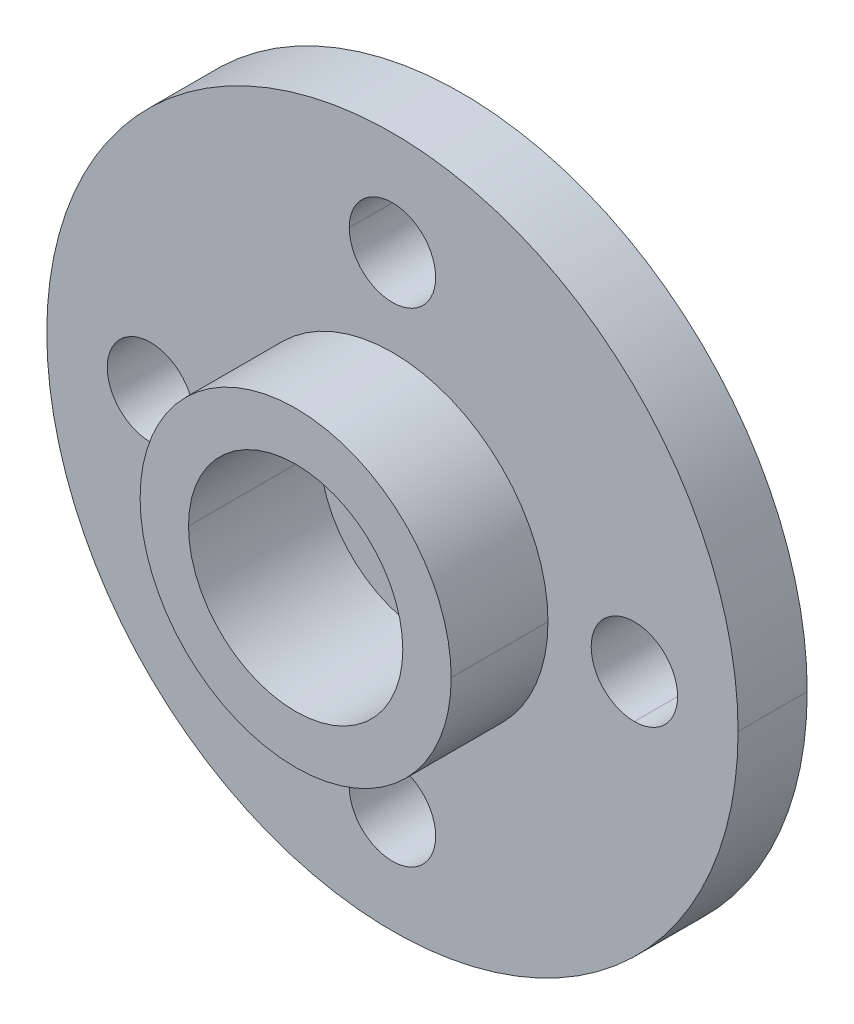
ISO-10303-21;
HEADER;
FILE_DESCRIPTION(('STEP AP214'),'2;1');
FILE_NAME('part.step','',(''),(''),'','','');
FILE_SCHEMA(('AUTOMOTIVE_DESIGN { 1 0 10303 214 1 1 1 1 }'));
ENDSEC;
DATA;
#1=APPLICATION_CONTEXT('core data for automotive mechanical design processes');
#2=APPLICATION_PROTOCOL_DEFINITION('international standard','automotive_design',2000,#1);
#3=PRODUCT_CONTEXT('',#1,'mechanical');
#4=PRODUCT('Part','Part','',(#3));
#5=PRODUCT_RELATED_PRODUCT_CATEGORY('part','',(#4));
#6=PRODUCT_DEFINITION_FORMATION('','',#4);
#7=PRODUCT_DEFINITION_CONTEXT('part definition',#1,'design');
#8=PRODUCT_DEFINITION('design','',#6,#7);
#9=PRODUCT_DEFINITION_SHAPE('','',#8);
#10=(LENGTH_UNIT() NAMED_UNIT(*) SI_UNIT(.MILLI.,.METRE.));
#11=(NAMED_UNIT(*) PLANE_ANGLE_UNIT() SI_UNIT($,.RADIAN.));
#12=(NAMED_UNIT(*) SI_UNIT($,.STERADIAN.) SOLID_ANGLE_UNIT());
#13=UNCERTAINTY_MEASURE_WITH_UNIT(LENGTH_MEASURE(1.E-05),#10,'distance_accuracy_value','');
#14=(GEOMETRIC_REPRESENTATION_CONTEXT(3) GLOBAL_UNCERTAINTY_ASSIGNED_CONTEXT((#13)) GLOBAL_UNIT_ASSIGNED_CONTEXT((#10,
#11,#12)) REPRESENTATION_CONTEXT('',''));
#15=CARTESIAN_POINT('',(0.,0.,0.));
#16=DIRECTION('',(0.,0.,1.));
#17=DIRECTION('',(1.,0.,0.));
#18=AXIS2_PLACEMENT_3D('',#15,#16,#17);
#19=CARTESIAN_POINT('',(-39.10264651977,-19.8999981269,-37.074));
#20=DIRECTION('',(0.,0.,-1.));
#21=DIRECTION('',(1.,0.,0.));
#22=AXIS2_PLACEMENT_3D('',#19,#20,#21);
#23=CYLINDRICAL_SURFACE('',#22,1.6);
#24=DIRECTION('',(0.,0.,-1.));
#25=VECTOR('',#24,1.);
#26=CARTESIAN_POINT('',(-37.50264651977,-19.8999981269,-35.124));
#27=LINE('',#26,#25);
#28=CARTESIAN_POINT('',(-37.50264651977,-19.8999981269,-35.124));
#29=VERTEX_POINT('',#28);
#30=CARTESIAN_POINT('',(-37.50264651977,-19.8999981269,-36.124));
#31=VERTEX_POINT('',#30);
#32=EDGE_CURVE('E11',#29,#31,#27,.T.);
#33=ORIENTED_EDGE('',*,*,#32,.F.);
#34=CARTESIAN_POINT('',(-39.10264651977,-19.8999981269,-35.124));
#35=DIRECTION('',(0.,0.,1.));
#36=DIRECTION('',(1.,0.,0.));
#37=AXIS2_PLACEMENT_3D('',#34,#35,#36);
#38=CIRCLE('',#37,1.6);
#39=CARTESIAN_POINT('',(-40.70264651977,-19.8999981269,-35.124));
#40=VERTEX_POINT('',#39);
#41=EDGE_CURVE('E186',#29,#40,#38,.T.);
#42=ORIENTED_EDGE('',*,*,#41,.T.);
#43=DIRECTION('',(0.,0.,-1.));
#44=VECTOR('',#43,1.);
#45=CARTESIAN_POINT('',(-40.70264651977,-19.8999981269,-35.124));
#46=LINE('',#45,#44);
#47=CARTESIAN_POINT('',(-40.70264651977,-19.8999981269,-36.124));
#48=VERTEX_POINT('',#47);
#49=EDGE_CURVE('E25',#40,#48,#46,.T.);
#50=ORIENTED_EDGE('',*,*,#49,.T.);
#51=CARTESIAN_POINT('',(-39.10264651977,-19.8999981269,-36.124));
#52=DIRECTION('',(0.,0.,-1.));
#53=DIRECTION('',(-1.,0.,0.));
#54=AXIS2_PLACEMENT_3D('',#51,#52,#53);
#55=CIRCLE('',#54,1.6);
#56=EDGE_CURVE('E289',#48,#31,#55,.T.);
#57=ORIENTED_EDGE('',*,*,#56,.T.);
#58=EDGE_LOOP('',(#33,#42,#50,#57));
#59=FACE_BOUND('',#58,.T.);
#60=ADVANCED_FACE('F17',(#59),#23,.F.);
#61=CARTESIAN_POINT('',(-39.10264651977,-19.8999981269,-37.074));
#62=DIRECTION('',(0.,0.,-1.));
#63=DIRECTION('',(1.,0.,0.));
#64=AXIS2_PLACEMENT_3D('',#61,#62,#63);
#65=CYLINDRICAL_SURFACE('',#64,1.6);
#66=ORIENTED_EDGE('',*,*,#49,.F.);
#67=CARTESIAN_POINT('',(-39.10264651977,-19.8999981269,-35.124));
#68=DIRECTION('',(0.,0.,1.));
#69=DIRECTION('',(-1.,0.,0.));
#70=AXIS2_PLACEMENT_3D('',#67,#68,#69);
#71=CIRCLE('',#70,1.6);
#72=EDGE_CURVE('E178',#40,#29,#71,.T.);
#73=ORIENTED_EDGE('',*,*,#72,.T.);
#74=ORIENTED_EDGE('',*,*,#32,.T.);
#75=CARTESIAN_POINT('',(-39.10264651977,-19.8999981269,-36.124));
#76=DIRECTION('',(0.,0.,-1.));
#77=DIRECTION('',(1.,0.,0.));
#78=AXIS2_PLACEMENT_3D('',#75,#76,#77);
#79=CIRCLE('',#78,1.6);
#80=EDGE_CURVE('E292',#31,#48,#79,.T.);
#81=ORIENTED_EDGE('',*,*,#80,.T.);
#82=EDGE_LOOP('',(#66,#73,#74,#81));
#83=FACE_BOUND('',#82,.T.);
#84=ADVANCED_FACE('F377',(#83),#65,.F.);
#85=CARTESIAN_POINT('',(-39.10264651977,-26.9,-36.124));
#86=DIRECTION('',(0.,0.,-1.));
#87=DIRECTION('',(1.,0.,0.));
#88=AXIS2_PLACEMENT_3D('',#85,#86,#87);
#89=CYLINDRICAL_SURFACE('',#88,1.25);
#90=DIRECTION('',(0.,0.,-1.));
#91=VECTOR('',#90,1.);
#92=CARTESIAN_POINT('',(-37.85264651977,-26.9,-34.124));
#93=LINE('',#92,#91);
#94=CARTESIAN_POINT('',(-37.85264651977,-26.9,-34.124));
#95=VERTEX_POINT('',#94);
#96=CARTESIAN_POINT('',(-37.85264651977,-26.9,-36.124));
#97=VERTEX_POINT('',#96);
#98=EDGE_CURVE('E285',#95,#97,#93,.T.);
#99=ORIENTED_EDGE('',*,*,#98,.F.);
#100=CARTESIAN_POINT('',(-39.10264651977,-26.9,-34.124));
#101=DIRECTION('',(0.,0.,1.));
#102=DIRECTION('',(1.,0.,0.));
#103=AXIS2_PLACEMENT_3D('',#100,#101,#102);
#104=CIRCLE('',#103,1.25);
#105=CARTESIAN_POINT('',(-40.35264651977,-26.9,-34.124));
#106=VERTEX_POINT('',#105);
#107=EDGE_CURVE('E254',#95,#106,#104,.T.);
#108=ORIENTED_EDGE('',*,*,#107,.T.);
#109=DIRECTION('',(0.,0.,-1.));
#110=VECTOR('',#109,1.);
#111=CARTESIAN_POINT('',(-40.35264651977,-26.9,-34.124));
#112=LINE('',#111,#110);
#113=CARTESIAN_POINT('',(-40.35264651977,-26.9,-36.124));
#114=VERTEX_POINT('',#113);
#115=EDGE_CURVE('E288',#106,#114,#112,.T.);
#116=ORIENTED_EDGE('',*,*,#115,.T.);
#117=CARTESIAN_POINT('',(-39.10264651977,-26.9,-36.124));
#118=DIRECTION('',(0.,0.,-1.));
#119=DIRECTION('',(-1.,0.,0.));
#120=AXIS2_PLACEMENT_3D('',#117,#118,#119);
#121=CIRCLE('',#120,1.25);
#122=EDGE_CURVE('E301',#114,#97,#121,.T.);
#123=ORIENTED_EDGE('',*,*,#122,.T.);
#124=EDGE_LOOP('',(#99,#108,#116,#123));
#125=FACE_BOUND('',#124,.T.);
#126=ADVANCED_FACE('F372',(#125),#89,.F.);
#127=CARTESIAN_POINT('',(-39.10264651977,-26.9,-36.124));
#128=DIRECTION('',(0.,0.,-1.));
#129=DIRECTION('',(1.,0.,0.));
#130=AXIS2_PLACEMENT_3D('',#127,#128,#129);
#131=CYLINDRICAL_SURFACE('',#130,1.25);
#132=ORIENTED_EDGE('',*,*,#115,.F.);
#133=CARTESIAN_POINT('',(-39.10264651977,-26.9,-34.124));
#134=DIRECTION('',(0.,0.,1.));
#135=DIRECTION('',(-1.,0.,0.));
#136=AXIS2_PLACEMENT_3D('',#133,#134,#135);
#137=CIRCLE('',#136,1.25);
#138=EDGE_CURVE('E258',#106,#95,#137,.T.);
#139=ORIENTED_EDGE('',*,*,#138,.T.);
#140=ORIENTED_EDGE('',*,*,#98,.T.);
#141=CARTESIAN_POINT('',(-39.10264651977,-26.9,-36.124));
#142=DIRECTION('',(0.,0.,-1.));
#143=DIRECTION('',(1.,0.,0.));
#144=AXIS2_PLACEMENT_3D('',#141,#142,#143);
#145=CIRCLE('',#144,1.25);
#146=EDGE_CURVE('E293',#97,#114,#145,.T.);
#147=ORIENTED_EDGE('',*,*,#146,.T.);
#148=EDGE_LOOP('',(#132,#139,#140,#147));
#149=FACE_BOUND('',#148,.T.);
#150=ADVANCED_FACE('F376',(#149),#131,.F.);
#151=CARTESIAN_POINT('',(-32.10264464667,-19.8999981269,-36.124));
#152=DIRECTION('',(0.,0.,-1.));
#153=DIRECTION('',(0.,1.,0.));
#154=AXIS2_PLACEMENT_3D('',#151,#152,#153);
#155=CYLINDRICAL_SURFACE('',#154,1.25);
#156=DIRECTION('',(0.,0.,-1.));
#157=VECTOR('',#156,1.);
#158=CARTESIAN_POINT('',(-32.10264464667,-18.6499981269,-34.124));
#159=LINE('',#158,#157);
#160=CARTESIAN_POINT('',(-32.10264464667,-18.6499981269,-34.124));
#161=VERTEX_POINT('',#160);
#162=CARTESIAN_POINT('',(-32.10264464667,-18.6499981269,-36.124));
#163=VERTEX_POINT('',#162);
#164=EDGE_CURVE('E329',#161,#163,#159,.T.);
#165=ORIENTED_EDGE('',*,*,#164,.F.);
#166=CARTESIAN_POINT('',(-32.10264464667,-19.8999981269,-34.124));
#167=DIRECTION('',(0.,0.,1.));
#168=DIRECTION('',(0.,1.,0.));
#169=AXIS2_PLACEMENT_3D('',#166,#167,#168);
#170=CIRCLE('',#169,1.25);
#171=CARTESIAN_POINT('',(-32.10264464667,-21.1499981269,-34.124));
#172=VERTEX_POINT('',#171);
#173=EDGE_CURVE('E246',#161,#172,#170,.T.);
#174=ORIENTED_EDGE('',*,*,#173,.T.);
#175=DIRECTION('',(0.,0.,-1.));
#176=VECTOR('',#175,1.);
#177=CARTESIAN_POINT('',(-32.10264464667,-21.1499981269,-34.124));
#178=LINE('',#177,#176);
#179=CARTESIAN_POINT('',(-32.10264464667,-21.1499981269,-36.124));
#180=VERTEX_POINT('',#179);
#181=EDGE_CURVE('E270',#172,#180,#178,.T.);
#182=ORIENTED_EDGE('',*,*,#181,.T.);
#183=CARTESIAN_POINT('',(-32.10264464667,-19.8999981269,-36.124));
#184=DIRECTION('',(0.,0.,-1.));
#185=DIRECTION('',(0.,-1.,0.));
#186=AXIS2_PLACEMENT_3D('',#183,#184,#185);
#187=CIRCLE('',#186,1.25);
#188=EDGE_CURVE('E310',#180,#163,#187,.T.);
#189=ORIENTED_EDGE('',*,*,#188,.T.);
#190=EDGE_LOOP('',(#165,#174,#182,#189));
#191=FACE_BOUND('',#190,.T.);
#192=ADVANCED_FACE('F470',(#191),#155,.F.);
#193=CARTESIAN_POINT('',(-32.10264464667,-19.8999981269,-36.124));
#194=DIRECTION('',(0.,0.,-1.));
#195=DIRECTION('',(0.,1.,0.));
#196=AXIS2_PLACEMENT_3D('',#193,#194,#195);
#197=CYLINDRICAL_SURFACE('',#196,1.25);
#198=ORIENTED_EDGE('',*,*,#181,.F.);
#199=CARTESIAN_POINT('',(-32.10264464667,-19.8999981269,-34.124));
#200=DIRECTION('',(0.,0.,1.));
#201=DIRECTION('',(0.,-1.,0.));
#202=AXIS2_PLACEMENT_3D('',#199,#200,#201);
#203=CIRCLE('',#202,1.25);
#204=EDGE_CURVE('E250',#172,#161,#203,.T.);
#205=ORIENTED_EDGE('',*,*,#204,.T.);
#206=ORIENTED_EDGE('',*,*,#164,.T.);
#207=CARTESIAN_POINT('',(-32.10264464667,-19.8999981269,-36.124));
#208=DIRECTION('',(0.,0.,-1.));
#209=DIRECTION('',(0.,1.,0.));
#210=AXIS2_PLACEMENT_3D('',#207,#208,#209);
#211=CIRCLE('',#210,1.25);
#212=EDGE_CURVE('E306',#163,#180,#211,.T.);
#213=ORIENTED_EDGE('',*,*,#212,.T.);
#214=EDGE_LOOP('',(#198,#205,#206,#213));
#215=FACE_BOUND('',#214,.T.);
#216=ADVANCED_FACE('F455',(#215),#197,.F.);
#217=CARTESIAN_POINT('',(-39.10264651977,-12.8999962538,-36.124));
#218=DIRECTION('',(0.,0.,-1.));
#219=DIRECTION('',(-1.,0.,0.));
#220=AXIS2_PLACEMENT_3D('',#217,#218,#219);
#221=CYLINDRICAL_SURFACE('',#220,1.25);
#222=DIRECTION('',(0.,0.,-1.));
#223=VECTOR('',#222,1.);
#224=CARTESIAN_POINT('',(-40.35264651977,-12.8999962538,-34.124));
#225=LINE('',#224,#223);
#226=CARTESIAN_POINT('',(-40.35264651977,-12.8999962538,-34.124));
#227=VERTEX_POINT('',#226);
#228=CARTESIAN_POINT('',(-40.35264651977,-12.8999962538,-36.124));
#229=VERTEX_POINT('',#228);
#230=EDGE_CURVE('E267',#227,#229,#225,.T.);
#231=ORIENTED_EDGE('',*,*,#230,.F.);
#232=CARTESIAN_POINT('',(-39.10264651977,-12.8999962538,-34.124));
#233=DIRECTION('',(0.,0.,1.));
#234=DIRECTION('',(-1.,0.,0.));
#235=AXIS2_PLACEMENT_3D('',#232,#233,#234);
#236=CIRCLE('',#235,1.25);
#237=CARTESIAN_POINT('',(-37.85264651977,-12.8999962538,-34.124));
#238=VERTEX_POINT('',#237);
#239=EDGE_CURVE('E212',#227,#238,#236,.T.);
#240=ORIENTED_EDGE('',*,*,#239,.T.);
#241=DIRECTION('',(0.,0.,-1.));
#242=VECTOR('',#241,1.);
#243=CARTESIAN_POINT('',(-37.85264651977,-12.8999962538,-34.124));
#244=LINE('',#243,#242);
#245=CARTESIAN_POINT('',(-37.85264651977,-12.8999962538,-36.124));
#246=VERTEX_POINT('',#245);
#247=EDGE_CURVE('E271',#238,#246,#244,.T.);
#248=ORIENTED_EDGE('',*,*,#247,.T.);
#249=CARTESIAN_POINT('',(-39.10264651977,-12.8999962538,-36.124));
#250=DIRECTION('',(0.,0.,-1.));
#251=DIRECTION('',(1.,0.,0.));
#252=AXIS2_PLACEMENT_3D('',#249,#250,#251);
#253=CIRCLE('',#252,1.25);
#254=EDGE_CURVE('E305',#246,#229,#253,.T.);
#255=ORIENTED_EDGE('',*,*,#254,.T.);
#256=EDGE_LOOP('',(#231,#240,#248,#255));
#257=FACE_BOUND('',#256,.T.);
#258=ADVANCED_FACE('F451',(#257),#221,.F.);
#259=CARTESIAN_POINT('',(-39.10264651977,-12.8999962538,-36.124));
#260=DIRECTION('',(0.,0.,-1.));
#261=DIRECTION('',(-1.,0.,0.));
#262=AXIS2_PLACEMENT_3D('',#259,#260,#261);
#263=CYLINDRICAL_SURFACE('',#262,1.25);
#264=ORIENTED_EDGE('',*,*,#247,.F.);
#265=CARTESIAN_POINT('',(-39.10264651977,-12.8999962538,-34.124));
#266=DIRECTION('',(0.,0.,1.));
#267=DIRECTION('',(1.,0.,0.));
#268=AXIS2_PLACEMENT_3D('',#265,#266,#267);
#269=CIRCLE('',#268,1.25);
#270=EDGE_CURVE('E242',#238,#227,#269,.T.);
#271=ORIENTED_EDGE('',*,*,#270,.T.);
#272=ORIENTED_EDGE('',*,*,#230,.T.);
#273=CARTESIAN_POINT('',(-39.10264651977,-12.8999962538,-36.124));
#274=DIRECTION('',(0.,0.,-1.));
#275=DIRECTION('',(-1.,0.,0.));
#276=AXIS2_PLACEMENT_3D('',#273,#274,#275);
#277=CIRCLE('',#276,1.25);
#278=EDGE_CURVE('E314',#229,#246,#277,.T.);
#279=ORIENTED_EDGE('',*,*,#278,.T.);
#280=EDGE_LOOP('',(#264,#271,#272,#279));
#281=FACE_BOUND('',#280,.T.);
#282=ADVANCED_FACE('F439',(#281),#263,.F.);
#283=CARTESIAN_POINT('',(-46.10264839287,-19.8999981269,-36.124));
#284=DIRECTION('',(0.,0.,-1.));
#285=DIRECTION('',(0.,-1.,0.));
#286=AXIS2_PLACEMENT_3D('',#283,#284,#285);
#287=CYLINDRICAL_SURFACE('',#286,1.25);
#288=DIRECTION('',(0.,0.,-1.));
#289=VECTOR('',#288,1.);
#290=CARTESIAN_POINT('',(-46.10264839287,-21.1499981269,-34.124));
#291=LINE('',#290,#289);
#292=CARTESIAN_POINT('',(-46.10264839287,-21.1499981269,-34.124));
#293=VERTEX_POINT('',#292);
#294=CARTESIAN_POINT('',(-46.10264839287,-21.1499981269,-36.124));
#295=VERTEX_POINT('',#294);
#296=EDGE_CURVE('E332',#293,#295,#291,.T.);
#297=ORIENTED_EDGE('',*,*,#296,.F.);
#298=CARTESIAN_POINT('',(-46.10264839287,-19.8999981269,-34.124));
#299=DIRECTION('',(0.,0.,1.));
#300=DIRECTION('',(0.,-1.,0.));
#301=AXIS2_PLACEMENT_3D('',#298,#299,#300);
#302=CIRCLE('',#301,1.25);
#303=CARTESIAN_POINT('',(-46.10264839287,-18.6499981269,-34.124));
#304=VERTEX_POINT('',#303);
#305=EDGE_CURVE('E266',#293,#304,#302,.T.);
#306=ORIENTED_EDGE('',*,*,#305,.T.);
#307=DIRECTION('',(0.,0.,-1.));
#308=VECTOR('',#307,1.);
#309=CARTESIAN_POINT('',(-46.10264839287,-18.6499981269,-34.124));
#310=LINE('',#309,#308);
#311=CARTESIAN_POINT('',(-46.10264839287,-18.6499981269,-36.124));
#312=VERTEX_POINT('',#311);
#313=EDGE_CURVE('E326',#304,#312,#310,.T.);
#314=ORIENTED_EDGE('',*,*,#313,.T.);
#315=CARTESIAN_POINT('',(-46.10264839287,-19.8999981269,-36.124));
#316=DIRECTION('',(0.,0.,-1.));
#317=DIRECTION('',(0.,1.,0.));
#318=AXIS2_PLACEMENT_3D('',#315,#316,#317);
#319=CIRCLE('',#318,1.25);
#320=EDGE_CURVE('E284',#312,#295,#319,.T.);
#321=ORIENTED_EDGE('',*,*,#320,.T.);
#322=EDGE_LOOP('',(#297,#306,#314,#321));
#323=FACE_BOUND('',#322,.T.);
#324=ADVANCED_FACE('F435',(#323),#287,.F.);
#325=CARTESIAN_POINT('',(-46.10264839287,-19.8999981269,-36.124));
#326=DIRECTION('',(0.,0.,-1.));
#327=DIRECTION('',(0.,-1.,0.));
#328=AXIS2_PLACEMENT_3D('',#325,#326,#327);
#329=CYLINDRICAL_SURFACE('',#328,1.25);
#330=ORIENTED_EDGE('',*,*,#313,.F.);
#331=CARTESIAN_POINT('',(-46.10264839287,-19.8999981269,-34.124));
#332=DIRECTION('',(0.,0.,1.));
#333=DIRECTION('',(0.,1.,0.));
#334=AXIS2_PLACEMENT_3D('',#331,#332,#333);
#335=CIRCLE('',#334,1.25);
#336=EDGE_CURVE('E275',#304,#293,#335,.T.);
#337=ORIENTED_EDGE('',*,*,#336,.T.);
#338=ORIENTED_EDGE('',*,*,#296,.T.);
#339=CARTESIAN_POINT('',(-46.10264839287,-19.8999981269,-36.124));
#340=DIRECTION('',(0.,0.,-1.));
#341=DIRECTION('',(0.,-1.,0.));
#342=AXIS2_PLACEMENT_3D('',#339,#340,#341);
#343=CIRCLE('',#342,1.25);
#344=EDGE_CURVE('E297',#295,#312,#343,.T.);
#345=ORIENTED_EDGE('',*,*,#344,.T.);
#346=EDGE_LOOP('',(#330,#337,#338,#345));
#347=FACE_BOUND('',#346,.T.);
#348=ADVANCED_FACE('F430',(#347),#329,.F.);
#349=CARTESIAN_POINT('',(-28.10437565297,-19.9,-36.124));
#350=DIRECTION('',(0.,0.,-1.));
#351=DIRECTION('',(0.,-1.,0.));
#352=AXIS2_PLACEMENT_3D('',#349,#350,#351);
#353=PLANE('',#352);
#354=ORIENTED_EDGE('',*,*,#56,.F.);
#355=ORIENTED_EDGE('',*,*,#80,.F.);
#356=EDGE_LOOP('',(#354,#355));
#357=FACE_BOUND('',#356,.T.);
#358=ORIENTED_EDGE('',*,*,#122,.F.);
#359=ORIENTED_EDGE('',*,*,#146,.F.);
#360=EDGE_LOOP('',(#358,#359));
#361=FACE_BOUND('',#360,.T.);
#362=ORIENTED_EDGE('',*,*,#188,.F.);
#363=ORIENTED_EDGE('',*,*,#212,.F.);
#364=EDGE_LOOP('',(#362,#363));
#365=FACE_BOUND('',#364,.T.);
#366=ORIENTED_EDGE('',*,*,#254,.F.);
#367=ORIENTED_EDGE('',*,*,#278,.F.);
#368=EDGE_LOOP('',(#366,#367));
#369=FACE_BOUND('',#368,.T.);
#370=ORIENTED_EDGE('',*,*,#320,.F.);
#371=ORIENTED_EDGE('',*,*,#344,.F.);
#372=EDGE_LOOP('',(#370,#371));
#373=FACE_BOUND('',#372,.T.);
#374=CARTESIAN_POINT('',(-39.10264651977,-19.8999981269,-36.124));
#375=DIRECTION('',(0.,0.,1.));
#376=DIRECTION('',(-1.,0.,0.));
#377=AXIS2_PLACEMENT_3D('',#374,#375,#376);
#378=CIRCLE('',#377,10.);
#379=CARTESIAN_POINT('',(-49.10264651977,-19.8999981269,-36.124));
#380=VERTEX_POINT('',#379);
#381=CARTESIAN_POINT('',(-29.10264651977,-19.8999981269,-36.124));
#382=VERTEX_POINT('',#381);
#383=EDGE_CURVE('E262',#380,#382,#378,.T.);
#384=ORIENTED_EDGE('',*,*,#383,.F.);
#385=CARTESIAN_POINT('',(-39.10264651977,-19.8999981269,-36.124));
#386=DIRECTION('',(0.,0.,1.));
#387=DIRECTION('',(1.,0.,0.));
#388=AXIS2_PLACEMENT_3D('',#385,#386,#387);
#389=CIRCLE('',#388,10.);
#390=EDGE_CURVE('E218',#382,#380,#389,.T.);
#391=ORIENTED_EDGE('',*,*,#390,.F.);
#392=EDGE_LOOP('',(#384,#391));
#393=FACE_BOUND('',#392,.T.);
#394=ADVANCED_FACE('F361',(#357,#361,#365,#369,#373,#393),#353,.T.);
#395=CARTESIAN_POINT('',(-39.10264651977,-19.8999981269,-36.124));
#396=DIRECTION('',(0.,0.,-1.));
#397=DIRECTION('',(1.,0.,0.));
#398=AXIS2_PLACEMENT_3D('',#395,#396,#397);
#399=CYLINDRICAL_SURFACE('',#398,10.);
#400=DIRECTION('',(0.,0.,-1.));
#401=VECTOR('',#400,1.);
#402=CARTESIAN_POINT('',(-49.10264651977,-19.8999981269,-34.124));
#403=LINE('',#402,#401);
#404=CARTESIAN_POINT('',(-49.10264651977,-19.8999981269,-34.124));
#405=VERTEX_POINT('',#404);
#406=EDGE_CURVE('E222',#405,#380,#403,.T.);
#407=ORIENTED_EDGE('',*,*,#406,.T.);
#408=ORIENTED_EDGE('',*,*,#383,.T.);
#409=DIRECTION('',(0.,0.,-1.));
#410=VECTOR('',#409,1.);
#411=CARTESIAN_POINT('',(-29.10264651977,-19.8999981269,-34.124));
#412=LINE('',#411,#410);
#413=CARTESIAN_POINT('',(-29.10264651977,-19.8999981269,-34.124));
#414=VERTEX_POINT('',#413);
#415=EDGE_CURVE('E223',#414,#382,#412,.T.);
#416=ORIENTED_EDGE('',*,*,#415,.F.);
#417=CARTESIAN_POINT('',(-39.10264651977,-19.8999981269,-34.124));
#418=DIRECTION('',(0.,0.,-1.));
#419=DIRECTION('',(1.,0.,0.));
#420=AXIS2_PLACEMENT_3D('',#417,#418,#419);
#421=CIRCLE('',#420,10.);
#422=EDGE_CURVE('E213',#414,#405,#421,.T.);
#423=ORIENTED_EDGE('',*,*,#422,.T.);
#424=EDGE_LOOP('',(#407,#408,#416,#423));
#425=FACE_BOUND('',#424,.T.);
#426=ADVANCED_FACE('F356',(#425),#399,.T.);
#427=CARTESIAN_POINT('',(-39.10264651977,-19.8999981269,-36.124));
#428=DIRECTION('',(0.,0.,-1.));
#429=DIRECTION('',(1.,0.,0.));
#430=AXIS2_PLACEMENT_3D('',#427,#428,#429);
#431=CYLINDRICAL_SURFACE('',#430,10.);
#432=ORIENTED_EDGE('',*,*,#415,.T.);
#433=ORIENTED_EDGE('',*,*,#390,.T.);
#434=ORIENTED_EDGE('',*,*,#406,.F.);
#435=CARTESIAN_POINT('',(-39.10264651977,-19.8999981269,-34.124));
#436=DIRECTION('',(0.,0.,-1.));
#437=DIRECTION('',(-1.,0.,0.));
#438=AXIS2_PLACEMENT_3D('',#435,#436,#437);
#439=CIRCLE('',#438,10.);
#440=EDGE_CURVE('E208',#405,#414,#439,.T.);
#441=ORIENTED_EDGE('',*,*,#440,.T.);
#442=EDGE_LOOP('',(#432,#433,#434,#441));
#443=FACE_BOUND('',#442,.T.);
#444=ADVANCED_FACE('F360',(#443),#431,.T.);
#445=CARTESIAN_POINT('',(-39.10264565297,-19.9,-34.124));
#446=DIRECTION('',(0.,0.,1.));
#447=DIRECTION('',(1.,0.,0.));
#448=AXIS2_PLACEMENT_3D('',#445,#446,#447);
#449=PLANE('',#448);
#450=ORIENTED_EDGE('',*,*,#305,.F.);
#451=ORIENTED_EDGE('',*,*,#336,.F.);
#452=EDGE_LOOP('',(#450,#451));
#453=FACE_BOUND('',#452,.T.);
#454=CARTESIAN_POINT('',(-39.10264651977,-19.8999981269,-34.124));
#455=DIRECTION('',(0.,0.,1.));
#456=DIRECTION('',(-1.,0.,0.));
#457=AXIS2_PLACEMENT_3D('',#454,#455,#456);
#458=CIRCLE('',#457,4.5);
#459=CARTESIAN_POINT('',(-43.60264651977,-19.8999981269,-34.124));
#460=VERTEX_POINT('',#459);
#461=CARTESIAN_POINT('',(-34.60264651977,-19.8999981269,-34.124));
#462=VERTEX_POINT('',#461);
#463=EDGE_CURVE('E203',#460,#462,#458,.T.);
#464=ORIENTED_EDGE('',*,*,#463,.F.);
#465=CARTESIAN_POINT('',(-39.10264651977,-19.8999981269,-34.124));
#466=DIRECTION('',(0.,0.,1.));
#467=DIRECTION('',(1.,0.,0.));
#468=AXIS2_PLACEMENT_3D('',#465,#466,#467);
#469=CIRCLE('',#468,4.5);
#470=EDGE_CURVE('E198',#462,#460,#469,.T.);
#471=ORIENTED_EDGE('',*,*,#470,.F.);
#472=EDGE_LOOP('',(#464,#471));
#473=FACE_BOUND('',#472,.T.);
#474=ORIENTED_EDGE('',*,*,#107,.F.);
#475=ORIENTED_EDGE('',*,*,#138,.F.);
#476=EDGE_LOOP('',(#474,#475));
#477=FACE_BOUND('',#476,.T.);
#478=ORIENTED_EDGE('',*,*,#173,.F.);
#479=ORIENTED_EDGE('',*,*,#204,.F.);
#480=EDGE_LOOP('',(#478,#479));
#481=FACE_BOUND('',#480,.T.);
#482=ORIENTED_EDGE('',*,*,#239,.F.);
#483=ORIENTED_EDGE('',*,*,#270,.F.);
#484=EDGE_LOOP('',(#482,#483));
#485=FACE_BOUND('',#484,.T.);
#486=ORIENTED_EDGE('',*,*,#422,.F.);
#487=ORIENTED_EDGE('',*,*,#440,.F.);
#488=EDGE_LOOP('',(#486,#487));
#489=FACE_BOUND('',#488,.T.);
#490=ADVANCED_FACE('F385',(#453,#473,#477,#481,#485,#489),#449,.T.);
#491=CARTESIAN_POINT('',(-39.10264651977,-19.8999981269,-31.364));
#492=DIRECTION('',(0.,0.,-1.));
#493=DIRECTION('',(1.,0.,0.));
#494=AXIS2_PLACEMENT_3D('',#491,#492,#493);
#495=CYLINDRICAL_SURFACE('',#494,4.5);
#496=DIRECTION('',(0.,0.,1.));
#497=VECTOR('',#496,1.);
#498=CARTESIAN_POINT('',(-43.60264651977,-19.8999981269,-34.124));
#499=LINE('',#498,#497);
#500=CARTESIAN_POINT('',(-43.60264651977,-19.8999981269,-31.324));
#501=VERTEX_POINT('',#500);
#502=EDGE_CURVE('E200',#460,#501,#499,.T.);
#503=ORIENTED_EDGE('',*,*,#502,.F.);
#504=ORIENTED_EDGE('',*,*,#463,.T.);
#505=DIRECTION('',(0.,0.,1.));
#506=VECTOR('',#505,1.);
#507=CARTESIAN_POINT('',(-34.60264651977,-19.8999981269,-34.124));
#508=LINE('',#507,#506);
#509=CARTESIAN_POINT('',(-34.60264651977,-19.8999981269,-31.324));
#510=VERTEX_POINT('',#509);
#511=EDGE_CURVE('E195',#462,#510,#508,.T.);
#512=ORIENTED_EDGE('',*,*,#511,.T.);
#513=CARTESIAN_POINT('',(-39.10264651977,-19.8999981269,-31.324));
#514=DIRECTION('',(0.,0.,-1.));
#515=DIRECTION('',(1.,0.,0.));
#516=AXIS2_PLACEMENT_3D('',#513,#514,#515);
#517=CIRCLE('',#516,4.5);
#518=EDGE_CURVE('E226',#510,#501,#517,.T.);
#519=ORIENTED_EDGE('',*,*,#518,.T.);
#520=EDGE_LOOP('',(#503,#504,#512,#519));
#521=FACE_BOUND('',#520,.T.);
#522=ADVANCED_FACE('F408',(#521),#495,.T.);
#523=CARTESIAN_POINT('',(-39.10264651977,-19.8999981269,-31.364));
#524=DIRECTION('',(0.,0.,-1.));
#525=DIRECTION('',(1.,0.,0.));
#526=AXIS2_PLACEMENT_3D('',#523,#524,#525);
#527=CYLINDRICAL_SURFACE('',#526,4.5);
#528=ORIENTED_EDGE('',*,*,#511,.F.);
#529=ORIENTED_EDGE('',*,*,#470,.T.);
#530=ORIENTED_EDGE('',*,*,#502,.T.);
#531=CARTESIAN_POINT('',(-39.10264651977,-19.8999981269,-31.324));
#532=DIRECTION('',(0.,0.,-1.));
#533=DIRECTION('',(-1.,0.,0.));
#534=AXIS2_PLACEMENT_3D('',#531,#532,#533);
#535=CIRCLE('',#534,4.5);
#536=EDGE_CURVE('E199',#501,#510,#535,.T.);
#537=ORIENTED_EDGE('',*,*,#536,.T.);
#538=EDGE_LOOP('',(#528,#529,#530,#537));
#539=FACE_BOUND('',#538,.T.);
#540=ADVANCED_FACE('F400',(#539),#527,.T.);
#541=CARTESIAN_POINT('',(-28.10437565297,-19.9,-31.324));
#542=DIRECTION('',(0.,0.,1.));
#543=DIRECTION('',(1.,0.,0.));
#544=AXIS2_PLACEMENT_3D('',#541,#542,#543);
#545=PLANE('',#544);
#546=CARTESIAN_POINT('',(-39.10264651977,-19.8999981269,-31.324));
#547=DIRECTION('',(0.,0.,1.));
#548=DIRECTION('',(-1.,0.,0.));
#549=AXIS2_PLACEMENT_3D('',#546,#547,#548);
#550=CIRCLE('',#549,3.1);
#551=CARTESIAN_POINT('',(-42.20264651977,-19.8999981269,-31.324));
#552=VERTEX_POINT('',#551);
#553=CARTESIAN_POINT('',(-36.00264651977,-19.8999981269,-31.324));
#554=VERTEX_POINT('',#553);
#555=EDGE_CURVE('E172',#552,#554,#550,.T.);
#556=ORIENTED_EDGE('',*,*,#555,.F.);
#557=CARTESIAN_POINT('',(-39.10264651977,-19.8999981269,-31.324));
#558=DIRECTION('',(0.,0.,1.));
#559=DIRECTION('',(1.,0.,0.));
#560=AXIS2_PLACEMENT_3D('',#557,#558,#559);
#561=CIRCLE('',#560,3.1);
#562=EDGE_CURVE('E177',#554,#552,#561,.T.);
#563=ORIENTED_EDGE('',*,*,#562,.F.);
#564=EDGE_LOOP('',(#556,#563));
#565=FACE_BOUND('',#564,.T.);
#566=ORIENTED_EDGE('',*,*,#518,.F.);
#567=ORIENTED_EDGE('',*,*,#536,.F.);
#568=EDGE_LOOP('',(#566,#567));
#569=FACE_BOUND('',#568,.T.);
#570=ADVANCED_FACE('F393',(#565,#569),#545,.T.);
#571=CARTESIAN_POINT('',(-39.10264651977,-19.8999981269,-35.124));
#572=DIRECTION('',(0.,0.,1.));
#573=DIRECTION('',(1.,0.,0.));
#574=AXIS2_PLACEMENT_3D('',#571,#572,#573);
#575=CYLINDRICAL_SURFACE('',#574,3.1);
#576=CARTESIAN_POINT('',(-39.10264651977,-19.8999981269,-35.124));
#577=DIRECTION('',(0.,0.,-1.));
#578=DIRECTION('',(1.,0.,0.));
#579=AXIS2_PLACEMENT_3D('',#576,#577,#578);
#580=CIRCLE('',#579,3.1);
#581=CARTESIAN_POINT('',(-36.00264651977,-19.8999981269,-35.124));
#582=VERTEX_POINT('',#581);
#583=CARTESIAN_POINT('',(-42.20264651977,-19.8999981269,-35.124));
#584=VERTEX_POINT('',#583);
#585=EDGE_CURVE('E171',#582,#584,#580,.T.);
#586=ORIENTED_EDGE('',*,*,#585,.T.);
#587=DIRECTION('',(0.,0.,-1.));
#588=VECTOR('',#587,1.);
#589=CARTESIAN_POINT('',(-42.20264651977,-19.8999981269,-31.324));
#590=LINE('',#589,#588);
#591=EDGE_CURVE('E183',#552,#584,#590,.T.);
#592=ORIENTED_EDGE('',*,*,#591,.F.);
#593=ORIENTED_EDGE('',*,*,#555,.T.);
#594=DIRECTION('',(0.,0.,1.));
#595=VECTOR('',#594,1.);
#596=CARTESIAN_POINT('',(-36.00264651977,-19.8999981269,-35.124));
#597=LINE('',#596,#595);
#598=EDGE_CURVE('E166',#582,#554,#597,.T.);
#599=ORIENTED_EDGE('',*,*,#598,.F.);
#600=EDGE_LOOP('',(#586,#592,#593,#599));
#601=FACE_BOUND('',#600,.T.);
#602=ADVANCED_FACE('F168',(#601),#575,.F.);
#603=CARTESIAN_POINT('',(-39.10264651977,-19.8999981269,-35.124));
#604=DIRECTION('',(0.,0.,1.));
#605=DIRECTION('',(1.,0.,0.));
#606=AXIS2_PLACEMENT_3D('',#603,#604,#605);
#607=CYLINDRICAL_SURFACE('',#606,3.1);
#608=CARTESIAN_POINT('',(-39.10264651977,-19.8999981269,-35.124));
#609=DIRECTION('',(0.,0.,-1.));
#610=DIRECTION('',(-1.,0.,0.));
#611=AXIS2_PLACEMENT_3D('',#608,#609,#610);
#612=CIRCLE('',#611,3.1);
#613=EDGE_CURVE('E181',#584,#582,#612,.T.);
#614=ORIENTED_EDGE('',*,*,#613,.T.);
#615=ORIENTED_EDGE('',*,*,#598,.T.);
#616=ORIENTED_EDGE('',*,*,#562,.T.);
#617=ORIENTED_EDGE('',*,*,#591,.T.);
#618=EDGE_LOOP('',(#614,#615,#616,#617));
#619=FACE_BOUND('',#618,.T.);
#620=ADVANCED_FACE('F182',(#619),#607,.F.);
#621=CARTESIAN_POINT('',(-28.10437565297,-19.9,-35.124));
#622=DIRECTION('',(0.,0.,1.));
#623=DIRECTION('',(1.,0.,0.));
#624=AXIS2_PLACEMENT_3D('',#621,#622,#623);
#625=PLANE('',#624);
#626=ORIENTED_EDGE('',*,*,#41,.F.);
#627=ORIENTED_EDGE('',*,*,#72,.F.);
#628=EDGE_LOOP('',(#626,#627));
#629=FACE_BOUND('',#628,.T.);
#630=ORIENTED_EDGE('',*,*,#585,.F.);
#631=ORIENTED_EDGE('',*,*,#613,.F.);
#632=EDGE_LOOP('',(#630,#631));
#633=FACE_BOUND('',#632,.T.);
#634=ADVANCED_FACE('F188',(#629,#633),#625,.T.);
#635=CLOSED_SHELL('',(#60,#84,#126,#150,#192,#216,#258,#282,#324,#348,#394,#426,#444,#490,#522,
#540,#570,#602,#620,#634));
#636=MANIFOLD_SOLID_BREP('B1',#635);
#637=ADVANCED_BREP_SHAPE_REPRESENTATION('',(#18,#636),#14);
#638=SHAPE_DEFINITION_REPRESENTATION(#9,#637);
ENDSEC;
END-ISO-10303-21;
